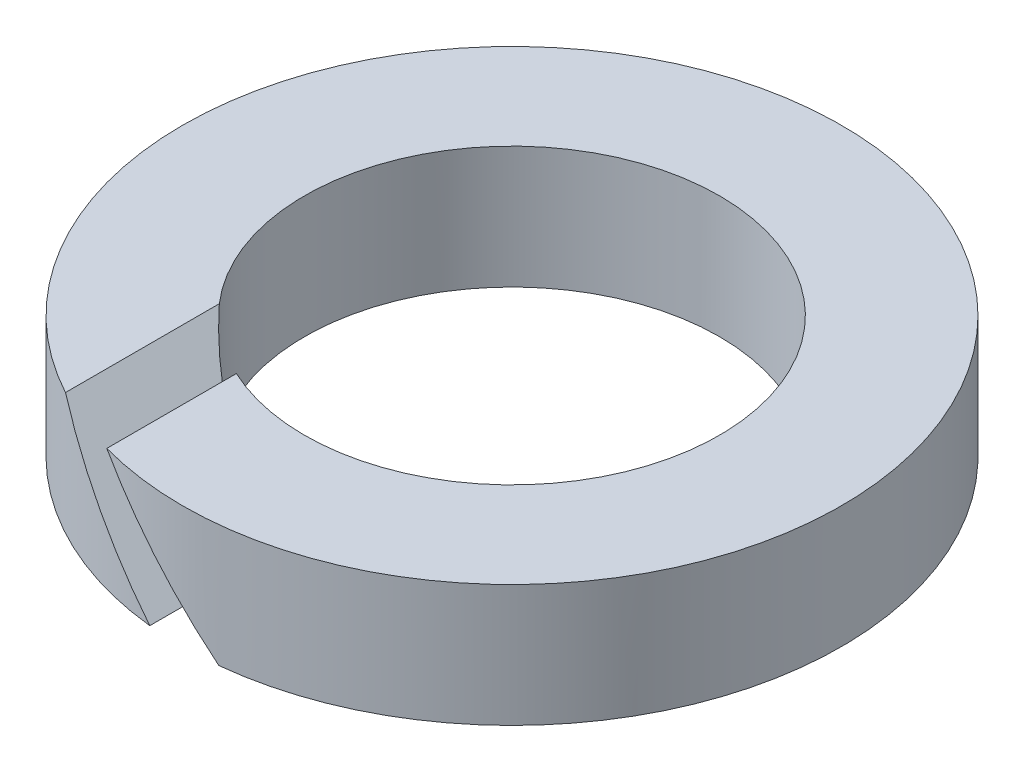
ISO-10303-21;
HEADER;
FILE_DESCRIPTION(('STEP AP214'),'2;1');
FILE_NAME('part.step','',(''),(''),'','','');
FILE_SCHEMA(('AUTOMOTIVE_DESIGN { 1 0 10303 214 1 1 1 1 }'));
ENDSEC;
DATA;
#1=APPLICATION_CONTEXT('core data for automotive mechanical design processes');
#2=APPLICATION_PROTOCOL_DEFINITION('international standard','automotive_design',2000,#1);
#3=PRODUCT_CONTEXT('',#1,'mechanical');
#4=PRODUCT('Part','Part','',(#3));
#5=PRODUCT_RELATED_PRODUCT_CATEGORY('part','',(#4));
#6=PRODUCT_DEFINITION_FORMATION('','',#4);
#7=PRODUCT_DEFINITION_CONTEXT('part definition',#1,'design');
#8=PRODUCT_DEFINITION('design','',#6,#7);
#9=PRODUCT_DEFINITION_SHAPE('','',#8);
#10=(LENGTH_UNIT() NAMED_UNIT(*) SI_UNIT(.MILLI.,.METRE.));
#11=(NAMED_UNIT(*) PLANE_ANGLE_UNIT() SI_UNIT($,.RADIAN.));
#12=(NAMED_UNIT(*) SI_UNIT($,.STERADIAN.) SOLID_ANGLE_UNIT());
#13=UNCERTAINTY_MEASURE_WITH_UNIT(LENGTH_MEASURE(1.E-05),#10,'distance_accuracy_value','');
#14=(GEOMETRIC_REPRESENTATION_CONTEXT(3) GLOBAL_UNCERTAINTY_ASSIGNED_CONTEXT((#13)) GLOBAL_UNIT_ASSIGNED_CONTEXT((#10,
#11,#12)) REPRESENTATION_CONTEXT('',''));
#15=CARTESIAN_POINT('',(0.,0.,0.));
#16=DIRECTION('',(0.,0.,1.));
#17=DIRECTION('',(1.,0.,0.));
#18=AXIS2_PLACEMENT_3D('',#15,#16,#17);
#19=CARTESIAN_POINT('',(-20.5719382807151,49.6058874503051,-10.4997520125234));
#20=DIRECTION('',(0.707106781186548,0.707106781186547,0.));
#21=DIRECTION('',(-0.707106781186547,0.707106781186548,0.));
#22=AXIS2_PLACEMENT_3D('',#19,#20,#21);
#23=PLANE('',#22);
#24=CARTESIAN_POINT('',(-23.5417867616986,52.5757359312886,-18.5997520125234));
#25=DIRECTION('',(0.707106781186548,0.707106781186547,0.));
#26=DIRECTION('',(-0.707106781186547,0.707106781186548,0.));
#27=AXIS2_PLACEMENT_3D('',#24,#25,#26);
#28=ELLIPSE('',#27,5.72756492761104,4.05);
#29=CARTESIAN_POINT('',(-23.9660508304104,53.0000000000004,-14.5720355378941));
#30=VERTEX_POINT('',#29);
#31=CARTESIAN_POINT('',(-25.4660490830566,54.4999999808544,-15.036086130514));
#32=VERTEX_POINT('',#31);
#33=EDGE_CURVE('E75',#30,#32,#28,.F.);
#34=ORIENTED_EDGE('',*,*,#33,.F.);
#35=DIRECTION('',(0.,0.,-1.));
#36=VECTOR('',#35,1.);
#37=CARTESIAN_POINT('',(-23.9660508304105,53.0000000000005,-10.4997520125234));
#38=LINE('',#37,#36);
#39=CARTESIAN_POINT('',(-23.966054376663,53.0000009907607,-16.0852953163054));
#40=VERTEX_POINT('',#39);
#41=EDGE_CURVE('E20',#30,#40,#38,.T.);
#42=ORIENTED_EDGE('',*,*,#41,.T.);
#43=CARTESIAN_POINT('',(-23.5417867616986,52.5757359312886,-18.5997520125234));
#44=DIRECTION('',(0.707106781186548,0.707106781186547,0.));
#45=DIRECTION('',(-0.707106781186547,0.707106781186548,0.));
#46=AXIS2_PLACEMENT_3D('',#43,#44,#45);
#47=ELLIPSE('',#46,3.60624458405139,2.55);
#48=CARTESIAN_POINT('',(-25.466049205797,54.5000002263352,-16.9265174066703));
#49=VERTEX_POINT('',#48);
#50=EDGE_CURVE('E77',#40,#49,#47,.F.);
#51=ORIENTED_EDGE('',*,*,#50,.T.);
#52=DIRECTION('',(0.,0.,1.));
#53=VECTOR('',#52,1.);
#54=CARTESIAN_POINT('',(-25.4660473548488,54.5000000000005,-14.4687520125233));
#55=LINE('',#54,#53);
#56=EDGE_CURVE('E64',#32,#49,#55,.F.);
#57=ORIENTED_EDGE('',*,*,#56,.F.);
#58=EDGE_LOOP('',(#34,#42,#51,#57));
#59=FACE_BOUND('',#58,.T.);
#60=ADVANCED_FACE('F17',(#59),#23,.T.);
#61=CARTESIAN_POINT('',(-19.4107867616986,54.5000000000005,-14.4687520125233));
#62=DIRECTION('',(0.,1.,0.));
#63=DIRECTION('',(0.,0.,1.));
#64=AXIS2_PLACEMENT_3D('',#61,#62,#63);
#65=PLANE('',#64);
#66=CARTESIAN_POINT('',(-23.5417867616986,54.5000000000005,-18.5997520125234));
#67=DIRECTION('',(0.,1.,0.));
#68=DIRECTION('',(0.,0.,1.));
#69=AXIS2_PLACEMENT_3D('',#66,#67,#68);
#70=CIRCLE('',#69,4.05);
#71=CARTESIAN_POINT('',(-24.6175224216668,54.4999997286804,-14.6952299175836));
#72=VERTEX_POINT('',#71);
#73=EDGE_CURVE('E56',#32,#72,#70,.F.);
#74=ORIENTED_EDGE('',*,*,#73,.F.);
#75=ORIENTED_EDGE('',*,*,#56,.T.);
#76=CARTESIAN_POINT('',(-23.5417867616986,54.5000002263352,-18.5997520125234));
#77=DIRECTION('',(0.,1.,0.));
#78=DIRECTION('',(0.,0.,1.));
#79=AXIS2_PLACEMENT_3D('',#76,#77,#78);
#80=CIRCLE('',#79,2.55);
#81=CARTESIAN_POINT('',(-24.6175224216668,54.4999997286804,-16.2877630874044));
#82=VERTEX_POINT('',#81);
#83=EDGE_CURVE('E59',#49,#82,#80,.F.);
#84=ORIENTED_EDGE('',*,*,#83,.T.);
#85=DIRECTION('',(0.,0.,1.));
#86=VECTOR('',#85,1.);
#87=CARTESIAN_POINT('',(-24.6175221503467,54.4999994573603,-10.4997520125234));
#88=LINE('',#87,#86);
#89=EDGE_CURVE('E52',#72,#82,#88,.F.);
#90=ORIENTED_EDGE('',*,*,#89,.F.);
#91=EDGE_LOOP('',(#74,#75,#84,#90));
#92=FACE_BOUND('',#91,.T.);
#93=ADVANCED_FACE('F54',(#92),#65,.T.);
#94=CARTESIAN_POINT('',(-26.5116352426822,56.3941125496958,-10.4997520125234));
#95=DIRECTION('',(-0.707106781186548,-0.707106781186547,0.));
#96=DIRECTION('',(0.707106781186547,-0.707106781186548,0.));
#97=AXIS2_PLACEMENT_3D('',#94,#95,#96);
#98=PLANE('',#97);
#99=CARTESIAN_POINT('',(-23.5417867616986,53.4242640687122,-18.5997520125234));
#100=DIRECTION('',(-0.707106781186548,-0.707106781186547,0.));
#101=DIRECTION('',(-0.707106781186547,0.707106781186548,0.));
#102=AXIS2_PLACEMENT_3D('',#99,#100,#101);
#103=ELLIPSE('',#102,3.60624458405139,2.55);
#104=CARTESIAN_POINT('',(-23.1175226964172,53.0000000034308,-16.0852938198085));
#105=VERTEX_POINT('',#104);
#106=EDGE_CURVE('E84',#82,#105,#103,.F.);
#107=ORIENTED_EDGE('',*,*,#106,.T.);
#108=DIRECTION('',(0.,0.,1.));
#109=VECTOR('',#108,1.);
#110=CARTESIAN_POINT('',(-23.1175226929869,53.0000000000005,-10.4997520125234));
#111=LINE('',#110,#109);
#112=CARTESIAN_POINT('',(-23.1175204471103,52.9999977541239,-14.5720360110431));
#113=VERTEX_POINT('',#112);
#114=EDGE_CURVE('E63',#105,#113,#111,.T.);
#115=ORIENTED_EDGE('',*,*,#114,.T.);
#116=CARTESIAN_POINT('',(-23.5417867616986,53.4242640687122,-18.5997520125234));
#117=DIRECTION('',(-0.707106781186548,-0.707106781186547,0.));
#118=DIRECTION('',(-0.707106781186547,0.707106781186548,0.));
#119=AXIS2_PLACEMENT_3D('',#116,#117,#118);
#120=ELLIPSE('',#119,5.72756492761104,4.05);
#121=EDGE_CURVE('E68',#72,#113,#120,.F.);
#122=ORIENTED_EDGE('',*,*,#121,.F.);
#123=ORIENTED_EDGE('',*,*,#89,.T.);
#124=EDGE_LOOP('',(#107,#115,#122,#123));
#125=FACE_BOUND('',#124,.T.);
#126=ADVANCED_FACE('F69',(#125),#98,.T.);
#127=CARTESIAN_POINT('',(-23.5417867616986,53.0000000000005,-18.5997520125234));
#128=DIRECTION('',(0.,1.,0.));
#129=DIRECTION('',(0.,0.,1.));
#130=AXIS2_PLACEMENT_3D('',#127,#128,#129);
#131=CYLINDRICAL_SURFACE('',#130,2.55);
#132=ORIENTED_EDGE('',*,*,#50,.F.);
#133=CARTESIAN_POINT('',(-23.5417867616986,53.0000000068611,-18.5997520125234));
#134=DIRECTION('',(0.,1.,0.));
#135=DIRECTION('',(0.,0.,1.));
#136=AXIS2_PLACEMENT_3D('',#133,#134,#135);
#137=CIRCLE('',#136,2.55);
#138=EDGE_CURVE('E26',#105,#40,#137,.T.);
#139=ORIENTED_EDGE('',*,*,#138,.F.);
#140=ORIENTED_EDGE('',*,*,#106,.F.);
#141=ORIENTED_EDGE('',*,*,#83,.F.);
#142=EDGE_LOOP('',(#132,#139,#140,#141));
#143=FACE_BOUND('',#142,.T.);
#144=ADVANCED_FACE('F88',(#143),#131,.F.);
#145=CARTESIAN_POINT('',(-23.5417867616986,54.5000000000004,-18.5997520125234));
#146=DIRECTION('',(0.,1.,0.));
#147=DIRECTION('',(0.,0.,1.));
#148=AXIS2_PLACEMENT_3D('',#145,#146,#147);
#149=CYLINDRICAL_SURFACE('',#148,4.05);
#150=ORIENTED_EDGE('',*,*,#121,.T.);
#151=CARTESIAN_POINT('',(-23.5417867616986,53.0000000000004,-18.5997520125234));
#152=DIRECTION('',(0.,1.,0.));
#153=DIRECTION('',(0.,0.,1.));
#154=AXIS2_PLACEMENT_3D('',#151,#152,#153);
#155=CIRCLE('',#154,4.05);
#156=EDGE_CURVE('E11',#30,#113,#155,.F.);
#157=ORIENTED_EDGE('',*,*,#156,.F.);
#158=ORIENTED_EDGE('',*,*,#33,.T.);
#159=ORIENTED_EDGE('',*,*,#73,.T.);
#160=EDGE_LOOP('',(#150,#157,#158,#159));
#161=FACE_BOUND('',#160,.T.);
#162=ADVANCED_FACE('F74',(#161),#149,.T.);
#163=CARTESIAN_POINT('',(-19.4107867616986,53.0000000000005,-22.7307520125235));
#164=DIRECTION('',(0.,-1.,0.));
#165=DIRECTION('',(0.,0.,-1.));
#166=AXIS2_PLACEMENT_3D('',#163,#164,#165);
#167=PLANE('',#166);
#168=ORIENTED_EDGE('',*,*,#156,.T.);
#169=ORIENTED_EDGE('',*,*,#114,.F.);
#170=ORIENTED_EDGE('',*,*,#138,.T.);
#171=ORIENTED_EDGE('',*,*,#41,.F.);
#172=EDGE_LOOP('',(#168,#169,#170,#171));
#173=FACE_BOUND('',#172,.T.);
#174=ADVANCED_FACE('F91',(#173),#167,.T.);
#175=CLOSED_SHELL('',(#60,#93,#126,#144,#162,#174));
#176=MANIFOLD_SOLID_BREP('B1',#175);
#177=ADVANCED_BREP_SHAPE_REPRESENTATION('',(#18,#176),#14);
#178=SHAPE_DEFINITION_REPRESENTATION(#9,#177);
ENDSEC;
END-ISO-10303-21;
